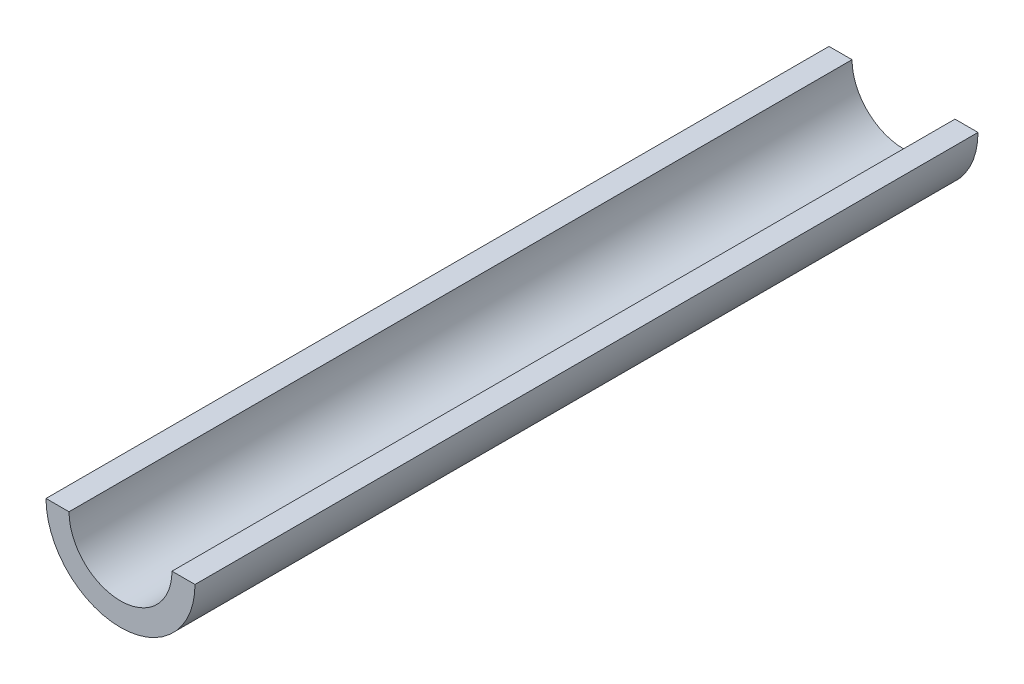
ISO-10303-21;
HEADER;
FILE_DESCRIPTION(('STEP AP214'),'2;1');
FILE_NAME('part.step','',(''),(''),'','','');
FILE_SCHEMA(('AUTOMOTIVE_DESIGN { 1 0 10303 214 1 1 1 1 }'));
ENDSEC;
DATA;
#1=APPLICATION_CONTEXT('core data for automotive mechanical design processes');
#2=APPLICATION_PROTOCOL_DEFINITION('international standard','automotive_design',2000,#1);
#3=PRODUCT_CONTEXT('',#1,'mechanical');
#4=PRODUCT('Part','Part','',(#3));
#5=PRODUCT_RELATED_PRODUCT_CATEGORY('part','',(#4));
#6=PRODUCT_DEFINITION_FORMATION('','',#4);
#7=PRODUCT_DEFINITION_CONTEXT('part definition',#1,'design');
#8=PRODUCT_DEFINITION('design','',#6,#7);
#9=PRODUCT_DEFINITION_SHAPE('','',#8);
#10=(LENGTH_UNIT() NAMED_UNIT(*) SI_UNIT(.MILLI.,.METRE.));
#11=(NAMED_UNIT(*) PLANE_ANGLE_UNIT() SI_UNIT($,.RADIAN.));
#12=(NAMED_UNIT(*) SI_UNIT($,.STERADIAN.) SOLID_ANGLE_UNIT());
#13=UNCERTAINTY_MEASURE_WITH_UNIT(LENGTH_MEASURE(1.E-05),#10,'distance_accuracy_value','');
#14=(GEOMETRIC_REPRESENTATION_CONTEXT(3) GLOBAL_UNCERTAINTY_ASSIGNED_CONTEXT((#13)) GLOBAL_UNIT_ASSIGNED_CONTEXT((#10,
#11,#12)) REPRESENTATION_CONTEXT('',''));
#15=CARTESIAN_POINT('',(0.,0.,0.));
#16=DIRECTION('',(0.,0.,1.));
#17=DIRECTION('',(1.,0.,0.));
#18=AXIS2_PLACEMENT_3D('',#15,#16,#17);
#19=CARTESIAN_POINT('',(0.,0.,170.));
#20=DIRECTION('',(0.,0.,-1.));
#21=DIRECTION('',(-1.,0.,0.));
#22=AXIS2_PLACEMENT_3D('',#19,#20,#21);
#23=CYLINDRICAL_SURFACE('',#22,16.175);
#24=CARTESIAN_POINT('',(0.,0.,0.));
#25=DIRECTION('',(0.,0.,1.));
#26=DIRECTION('',(1.,0.,0.));
#27=AXIS2_PLACEMENT_3D('',#24,#25,#26);
#28=CIRCLE('',#27,16.175);
#29=CARTESIAN_POINT('',(-16.175,0.,0.));
#30=VERTEX_POINT('',#29);
#31=CARTESIAN_POINT('',(16.175,0.,0.));
#32=VERTEX_POINT('',#31);
#33=EDGE_CURVE('E107',#30,#32,#28,.T.);
#34=ORIENTED_EDGE('',*,*,#33,.T.);
#35=DIRECTION('',(0.,0.,-1.));
#36=VECTOR('',#35,1.);
#37=CARTESIAN_POINT('',(16.175,0.,170.));
#38=LINE('',#37,#36);
#39=CARTESIAN_POINT('',(16.175,0.,170.));
#40=VERTEX_POINT('',#39);
#41=EDGE_CURVE('E11',#40,#32,#38,.T.);
#42=ORIENTED_EDGE('',*,*,#41,.F.);
#43=CARTESIAN_POINT('',(0.,0.,170.));
#44=DIRECTION('',(0.,0.,1.));
#45=DIRECTION('',(1.,0.,0.));
#46=AXIS2_PLACEMENT_3D('',#43,#44,#45);
#47=CIRCLE('',#46,16.175);
#48=CARTESIAN_POINT('',(-16.175,0.,170.));
#49=VERTEX_POINT('',#48);
#50=EDGE_CURVE('E91',#49,#40,#47,.T.);
#51=ORIENTED_EDGE('',*,*,#50,.F.);
#52=DIRECTION('',(0.,0.,-1.));
#53=VECTOR('',#52,1.);
#54=CARTESIAN_POINT('',(-16.175,0.,170.));
#55=LINE('',#54,#53);
#56=EDGE_CURVE('E103',#49,#30,#55,.T.);
#57=ORIENTED_EDGE('',*,*,#56,.T.);
#58=EDGE_LOOP('',(#34,#42,#51,#57));
#59=FACE_BOUND('',#58,.T.);
#60=ADVANCED_FACE('F39',(#59),#23,.T.);
#61=CARTESIAN_POINT('',(11.175,0.,170.));
#62=DIRECTION('',(0.,-1.,0.));
#63=DIRECTION('',(0.,0.,-1.));
#64=AXIS2_PLACEMENT_3D('',#61,#62,#63);
#65=PLANE('',#64);
#66=DIRECTION('',(-1.,0.,0.));
#67=VECTOR('',#66,1.);
#68=CARTESIAN_POINT('',(11.175,0.,0.));
#69=LINE('',#68,#67);
#70=CARTESIAN_POINT('',(11.175,0.,0.));
#71=VERTEX_POINT('',#70);
#72=EDGE_CURVE('E96',#32,#71,#69,.T.);
#73=ORIENTED_EDGE('',*,*,#72,.T.);
#74=DIRECTION('',(0.,0.,-1.));
#75=VECTOR('',#74,1.);
#76=CARTESIAN_POINT('',(11.175,0.,170.));
#77=LINE('',#76,#75);
#78=CARTESIAN_POINT('',(11.175,0.,170.));
#79=VERTEX_POINT('',#78);
#80=EDGE_CURVE('E48',#79,#71,#77,.T.);
#81=ORIENTED_EDGE('',*,*,#80,.F.);
#82=DIRECTION('',(-1.,0.,0.));
#83=VECTOR('',#82,1.);
#84=CARTESIAN_POINT('',(11.175,0.,170.));
#85=LINE('',#84,#83);
#86=EDGE_CURVE('E86',#40,#79,#85,.T.);
#87=ORIENTED_EDGE('',*,*,#86,.F.);
#88=ORIENTED_EDGE('',*,*,#41,.T.);
#89=EDGE_LOOP('',(#73,#81,#87,#88));
#90=FACE_BOUND('',#89,.T.);
#91=ADVANCED_FACE('F95',(#90),#65,.F.);
#92=CARTESIAN_POINT('',(0.,0.,170.));
#93=DIRECTION('',(0.,0.,-1.));
#94=DIRECTION('',(-1.,0.,0.));
#95=AXIS2_PLACEMENT_3D('',#92,#93,#94);
#96=CYLINDRICAL_SURFACE('',#95,11.175);
#97=CARTESIAN_POINT('',(0.,0.,0.));
#98=DIRECTION('',(0.,0.,-1.));
#99=DIRECTION('',(1.,0.,0.));
#100=AXIS2_PLACEMENT_3D('',#97,#98,#99);
#101=CIRCLE('',#100,11.175);
#102=CARTESIAN_POINT('',(-11.175,0.,0.));
#103=VERTEX_POINT('',#102);
#104=EDGE_CURVE('E73',#71,#103,#101,.T.);
#105=ORIENTED_EDGE('',*,*,#104,.T.);
#106=DIRECTION('',(0.,0.,-1.));
#107=VECTOR('',#106,1.);
#108=CARTESIAN_POINT('',(-11.175,0.,170.));
#109=LINE('',#108,#107);
#110=CARTESIAN_POINT('',(-11.175,0.,170.));
#111=VERTEX_POINT('',#110);
#112=EDGE_CURVE('E98',#111,#103,#109,.T.);
#113=ORIENTED_EDGE('',*,*,#112,.F.);
#114=CARTESIAN_POINT('',(0.,0.,170.));
#115=DIRECTION('',(0.,0.,-1.));
#116=DIRECTION('',(1.,0.,0.));
#117=AXIS2_PLACEMENT_3D('',#114,#115,#116);
#118=CIRCLE('',#117,11.175);
#119=EDGE_CURVE('E89',#79,#111,#118,.T.);
#120=ORIENTED_EDGE('',*,*,#119,.F.);
#121=ORIENTED_EDGE('',*,*,#80,.T.);
#122=EDGE_LOOP('',(#105,#113,#120,#121));
#123=FACE_BOUND('',#122,.T.);
#124=ADVANCED_FACE('F99',(#123),#96,.F.);
#125=CARTESIAN_POINT('',(-16.175,0.,170.));
#126=DIRECTION('',(0.,-1.,0.));
#127=DIRECTION('',(0.,0.,-1.));
#128=AXIS2_PLACEMENT_3D('',#125,#126,#127);
#129=PLANE('',#128);
#130=DIRECTION('',(-1.,0.,0.));
#131=VECTOR('',#130,1.);
#132=CARTESIAN_POINT('',(-16.175,0.,0.));
#133=LINE('',#132,#131);
#134=EDGE_CURVE('E79',#103,#30,#133,.T.);
#135=ORIENTED_EDGE('',*,*,#134,.T.);
#136=ORIENTED_EDGE('',*,*,#56,.F.);
#137=DIRECTION('',(-1.,0.,0.));
#138=VECTOR('',#137,1.);
#139=CARTESIAN_POINT('',(-16.175,0.,170.));
#140=LINE('',#139,#138);
#141=EDGE_CURVE('E56',#111,#49,#140,.T.);
#142=ORIENTED_EDGE('',*,*,#141,.F.);
#143=ORIENTED_EDGE('',*,*,#112,.T.);
#144=EDGE_LOOP('',(#135,#136,#142,#143));
#145=FACE_BOUND('',#144,.T.);
#146=ADVANCED_FACE('F120',(#145),#129,.F.);
#147=CARTESIAN_POINT('',(0.,0.,170.));
#148=DIRECTION('',(0.,0.,1.));
#149=DIRECTION('',(1.,0.,0.));
#150=AXIS2_PLACEMENT_3D('',#147,#148,#149);
#151=PLANE('',#150);
#152=ORIENTED_EDGE('',*,*,#50,.T.);
#153=ORIENTED_EDGE('',*,*,#86,.T.);
#154=ORIENTED_EDGE('',*,*,#119,.T.);
#155=ORIENTED_EDGE('',*,*,#141,.T.);
#156=EDGE_LOOP('',(#152,#153,#154,#155));
#157=FACE_BOUND('',#156,.T.);
#158=ADVANCED_FACE('F87',(#157),#151,.T.);
#159=CARTESIAN_POINT('',(0.,0.,0.));
#160=DIRECTION('',(0.,0.,1.));
#161=DIRECTION('',(1.,0.,0.));
#162=AXIS2_PLACEMENT_3D('',#159,#160,#161);
#163=PLANE('',#162);
#164=ORIENTED_EDGE('',*,*,#33,.F.);
#165=ORIENTED_EDGE('',*,*,#134,.F.);
#166=ORIENTED_EDGE('',*,*,#104,.F.);
#167=ORIENTED_EDGE('',*,*,#72,.F.);
#168=EDGE_LOOP('',(#164,#165,#166,#167));
#169=FACE_BOUND('',#168,.T.);
#170=ADVANCED_FACE('F123',(#169),#163,.F.);
#171=CLOSED_SHELL('',(#60,#91,#124,#146,#158,#170));
#172=MANIFOLD_SOLID_BREP('B2',#171);
#173=ADVANCED_BREP_SHAPE_REPRESENTATION('',(#18,#172),#14);
#174=SHAPE_DEFINITION_REPRESENTATION(#9,#173);
ENDSEC;
END-ISO-10303-21;
